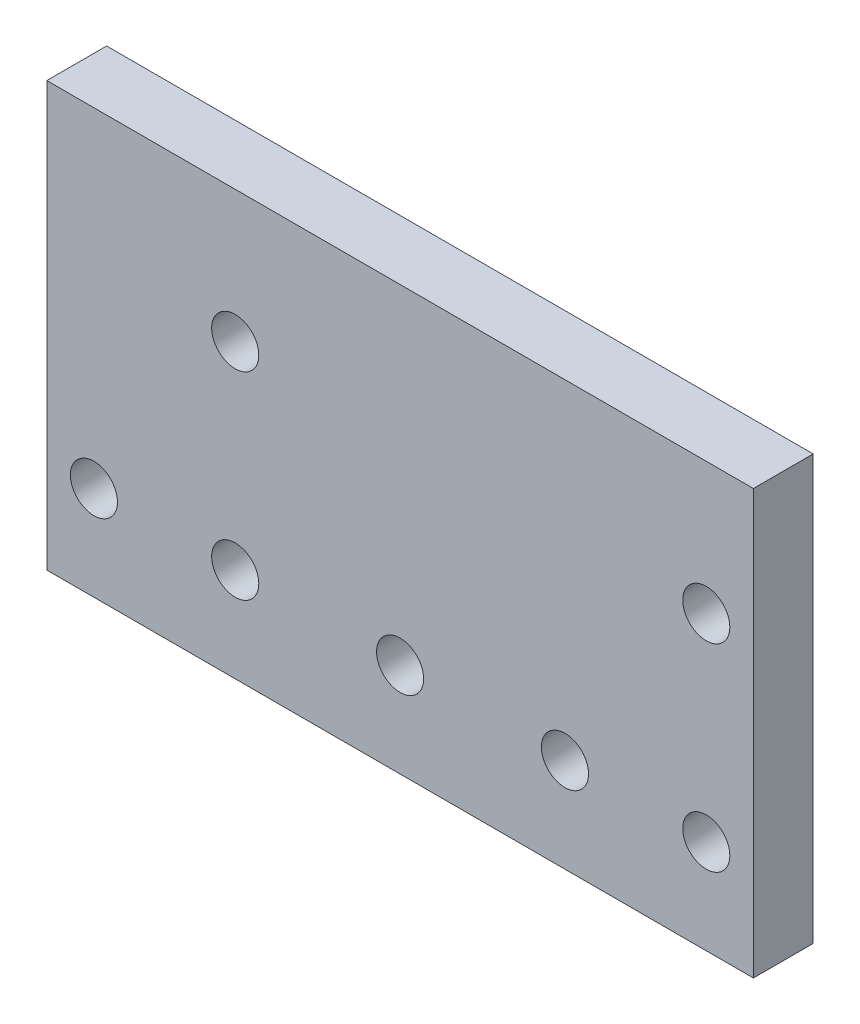
ISO-10303-21;
HEADER;
FILE_DESCRIPTION(('STEP AP214'),'2;1');
FILE_NAME('part.step','',(''),(''),'','','');
FILE_SCHEMA(('AUTOMOTIVE_DESIGN { 1 0 10303 214 1 1 1 1 }'));
ENDSEC;
DATA;
#1=APPLICATION_CONTEXT('core data for automotive mechanical design processes');
#2=APPLICATION_PROTOCOL_DEFINITION('international standard','automotive_design',2000,#1);
#3=PRODUCT_CONTEXT('',#1,'mechanical');
#4=PRODUCT('Part','Part','',(#3));
#5=PRODUCT_RELATED_PRODUCT_CATEGORY('part','',(#4));
#6=PRODUCT_DEFINITION_FORMATION('','',#4);
#7=PRODUCT_DEFINITION_CONTEXT('part definition',#1,'design');
#8=PRODUCT_DEFINITION('design','',#6,#7);
#9=PRODUCT_DEFINITION_SHAPE('','',#8);
#10=(LENGTH_UNIT() NAMED_UNIT(*) SI_UNIT(.MILLI.,.METRE.));
#11=(NAMED_UNIT(*) PLANE_ANGLE_UNIT() SI_UNIT($,.RADIAN.));
#12=(NAMED_UNIT(*) SI_UNIT($,.STERADIAN.) SOLID_ANGLE_UNIT());
#13=UNCERTAINTY_MEASURE_WITH_UNIT(LENGTH_MEASURE(1.E-05),#10,'distance_accuracy_value','');
#14=(GEOMETRIC_REPRESENTATION_CONTEXT(3) GLOBAL_UNCERTAINTY_ASSIGNED_CONTEXT((#13)) GLOBAL_UNIT_ASSIGNED_CONTEXT((#10,
#11,#12)) REPRESENTATION_CONTEXT('',''));
#15=CARTESIAN_POINT('',(0.,0.,0.));
#16=DIRECTION('',(0.,0.,1.));
#17=DIRECTION('',(1.,0.,0.));
#18=AXIS2_PLACEMENT_3D('',#15,#16,#17);
#19=CARTESIAN_POINT('',(0.,0.,6.35));
#20=DIRECTION('',(0.,0.,-1.));
#21=DIRECTION('',(-1.,0.,0.));
#22=AXIS2_PLACEMENT_3D('',#19,#20,#21);
#23=PLANE('',#22);
#24=CARTESIAN_POINT('',(70.,10.,6.35));
#25=DIRECTION('',(0.,0.,1.));
#26=DIRECTION('',(1.,0.,0.));
#27=AXIS2_PLACEMENT_3D('',#24,#25,#26);
#28=CIRCLE('',#27,2.50000000000001);
#29=CARTESIAN_POINT('',(72.5,10.,6.35));
#30=VERTEX_POINT('',#29);
#31=EDGE_CURVE('E139',#30,#30,#28,.T.);
#32=ORIENTED_EDGE('',*,*,#31,.F.);
#33=EDGE_LOOP('',(#32));
#34=FACE_BOUND('',#33,.T.);
#35=CARTESIAN_POINT('',(20.,10.,6.35));
#36=DIRECTION('',(0.,0.,1.));
#37=DIRECTION('',(1.,0.,0.));
#38=AXIS2_PLACEMENT_3D('',#35,#36,#37);
#39=CIRCLE('',#38,2.5);
#40=CARTESIAN_POINT('',(22.5,10.,6.35));
#41=VERTEX_POINT('',#40);
#42=EDGE_CURVE('E127',#41,#41,#39,.T.);
#43=ORIENTED_EDGE('',*,*,#42,.F.);
#44=EDGE_LOOP('',(#43));
#45=FACE_BOUND('',#44,.T.);
#46=CARTESIAN_POINT('',(70.,31.,6.35));
#47=DIRECTION('',(0.,0.,1.));
#48=DIRECTION('',(1.,0.,0.));
#49=AXIS2_PLACEMENT_3D('',#46,#47,#48);
#50=CIRCLE('',#49,2.5);
#51=CARTESIAN_POINT('',(72.5,31.,6.35));
#52=VERTEX_POINT('',#51);
#53=EDGE_CURVE('E115',#52,#52,#50,.T.);
#54=ORIENTED_EDGE('',*,*,#53,.F.);
#55=EDGE_LOOP('',(#54));
#56=FACE_BOUND('',#55,.T.);
#57=DIRECTION('',(0.,-1.,0.));
#58=VECTOR('',#57,1.);
#59=CARTESIAN_POINT('',(0.,0.,6.35));
#60=LINE('',#59,#58);
#61=CARTESIAN_POINT('',(0.,45.,6.35));
#62=VERTEX_POINT('',#61);
#63=CARTESIAN_POINT('',(0.,0.,6.35));
#64=VERTEX_POINT('',#63);
#65=EDGE_CURVE('E85',#62,#64,#60,.T.);
#66=ORIENTED_EDGE('',*,*,#65,.T.);
#67=DIRECTION('',(1.,0.,0.));
#68=VECTOR('',#67,1.);
#69=CARTESIAN_POINT('',(0.,0.,6.35));
#70=LINE('',#69,#68);
#71=CARTESIAN_POINT('',(75.,0.,6.35));
#72=VERTEX_POINT('',#71);
#73=EDGE_CURVE('E80',#64,#72,#70,.T.);
#74=ORIENTED_EDGE('',*,*,#73,.T.);
#75=DIRECTION('',(0.,1.,0.));
#76=VECTOR('',#75,1.);
#77=CARTESIAN_POINT('',(75.,0.,6.35));
#78=LINE('',#77,#76);
#79=CARTESIAN_POINT('',(75.,45.,6.35));
#80=VERTEX_POINT('',#79);
#81=EDGE_CURVE('E83',#72,#80,#78,.T.);
#82=ORIENTED_EDGE('',*,*,#81,.T.);
#83=DIRECTION('',(-1.,0.,0.));
#84=VECTOR('',#83,1.);
#85=CARTESIAN_POINT('',(0.,45.,6.35));
#86=LINE('',#85,#84);
#87=EDGE_CURVE('E50',#80,#62,#86,.T.);
#88=ORIENTED_EDGE('',*,*,#87,.T.);
#89=EDGE_LOOP('',(#66,#74,#82,#88));
#90=FACE_BOUND('',#89,.T.);
#91=CARTESIAN_POINT('',(20.,31.,6.35));
#92=DIRECTION('',(0.,0.,1.));
#93=DIRECTION('',(1.,0.,0.));
#94=AXIS2_PLACEMENT_3D('',#91,#92,#93);
#95=CIRCLE('',#94,2.5);
#96=CARTESIAN_POINT('',(22.5,31.,6.35));
#97=VERTEX_POINT('',#96);
#98=EDGE_CURVE('E100',#97,#97,#95,.T.);
#99=ORIENTED_EDGE('',*,*,#98,.F.);
#100=EDGE_LOOP('',(#99));
#101=FACE_BOUND('',#100,.T.);
#102=CARTESIAN_POINT('',(5.,10.,6.35));
#103=DIRECTION('',(0.,0.,1.));
#104=DIRECTION('',(1.,0.,0.));
#105=AXIS2_PLACEMENT_3D('',#102,#103,#104);
#106=CIRCLE('',#105,2.5);
#107=CARTESIAN_POINT('',(7.5,10.,6.35));
#108=VERTEX_POINT('',#107);
#109=EDGE_CURVE('E121',#108,#108,#106,.T.);
#110=ORIENTED_EDGE('',*,*,#109,.F.);
#111=EDGE_LOOP('',(#110));
#112=FACE_BOUND('',#111,.T.);
#113=CARTESIAN_POINT('',(55.,10.,6.35));
#114=DIRECTION('',(0.,0.,1.));
#115=DIRECTION('',(1.,0.,0.));
#116=AXIS2_PLACEMENT_3D('',#113,#114,#115);
#117=CIRCLE('',#116,2.5);
#118=CARTESIAN_POINT('',(57.5,10.,6.35));
#119=VERTEX_POINT('',#118);
#120=EDGE_CURVE('E133',#119,#119,#117,.T.);
#121=ORIENTED_EDGE('',*,*,#120,.F.);
#122=EDGE_LOOP('',(#121));
#123=FACE_BOUND('',#122,.T.);
#124=CARTESIAN_POINT('',(37.5,10.,6.35));
#125=DIRECTION('',(0.,0.,1.));
#126=DIRECTION('',(1.,0.,0.));
#127=AXIS2_PLACEMENT_3D('',#124,#125,#126);
#128=CIRCLE('',#127,2.5);
#129=CARTESIAN_POINT('',(40.,10.,6.35));
#130=VERTEX_POINT('',#129);
#131=EDGE_CURVE('E145',#130,#130,#128,.T.);
#132=ORIENTED_EDGE('',*,*,#131,.F.);
#133=EDGE_LOOP('',(#132));
#134=FACE_BOUND('',#133,.T.);
#135=ADVANCED_FACE('F33',(#34,#45,#56,#90,#101,#112,#123,#134),#23,.F.);
#136=CARTESIAN_POINT('',(0.,0.,0.));
#137=DIRECTION('',(0.,0.,-1.));
#138=DIRECTION('',(-1.,0.,0.));
#139=AXIS2_PLACEMENT_3D('',#136,#137,#138);
#140=PLANE('',#139);
#141=CARTESIAN_POINT('',(70.,10.,0.));
#142=DIRECTION('',(0.,0.,1.));
#143=DIRECTION('',(1.,0.,0.));
#144=AXIS2_PLACEMENT_3D('',#141,#142,#143);
#145=CIRCLE('',#144,2.50000000000001);
#146=CARTESIAN_POINT('',(72.5,10.,0.));
#147=VERTEX_POINT('',#146);
#148=EDGE_CURVE('E142',#147,#147,#145,.T.);
#149=ORIENTED_EDGE('',*,*,#148,.T.);
#150=EDGE_LOOP('',(#149));
#151=FACE_BOUND('',#150,.T.);
#152=CARTESIAN_POINT('',(20.,10.,0.));
#153=DIRECTION('',(0.,0.,1.));
#154=DIRECTION('',(1.,0.,0.));
#155=AXIS2_PLACEMENT_3D('',#152,#153,#154);
#156=CIRCLE('',#155,2.5);
#157=CARTESIAN_POINT('',(22.5,10.,0.));
#158=VERTEX_POINT('',#157);
#159=EDGE_CURVE('E130',#158,#158,#156,.T.);
#160=ORIENTED_EDGE('',*,*,#159,.T.);
#161=EDGE_LOOP('',(#160));
#162=FACE_BOUND('',#161,.T.);
#163=CARTESIAN_POINT('',(70.,31.,0.));
#164=DIRECTION('',(0.,0.,1.));
#165=DIRECTION('',(1.,0.,0.));
#166=AXIS2_PLACEMENT_3D('',#163,#164,#165);
#167=CIRCLE('',#166,2.5);
#168=CARTESIAN_POINT('',(72.5,31.,0.));
#169=VERTEX_POINT('',#168);
#170=EDGE_CURVE('E118',#169,#169,#167,.T.);
#171=ORIENTED_EDGE('',*,*,#170,.T.);
#172=EDGE_LOOP('',(#171));
#173=FACE_BOUND('',#172,.T.);
#174=DIRECTION('',(0.,-1.,0.));
#175=VECTOR('',#174,1.);
#176=CARTESIAN_POINT('',(0.,0.,0.));
#177=LINE('',#176,#175);
#178=CARTESIAN_POINT('',(0.,45.,0.));
#179=VERTEX_POINT('',#178);
#180=CARTESIAN_POINT('',(0.,0.,0.));
#181=VERTEX_POINT('',#180);
#182=EDGE_CURVE('E97',#179,#181,#177,.T.);
#183=ORIENTED_EDGE('',*,*,#182,.F.);
#184=DIRECTION('',(-1.,0.,0.));
#185=VECTOR('',#184,1.);
#186=CARTESIAN_POINT('',(0.,45.,0.));
#187=LINE('',#186,#185);
#188=CARTESIAN_POINT('',(75.,45.,0.));
#189=VERTEX_POINT('',#188);
#190=EDGE_CURVE('E73',#189,#179,#187,.T.);
#191=ORIENTED_EDGE('',*,*,#190,.F.);
#192=DIRECTION('',(0.,1.,0.));
#193=VECTOR('',#192,1.);
#194=CARTESIAN_POINT('',(75.,0.,0.));
#195=LINE('',#194,#193);
#196=CARTESIAN_POINT('',(75.,0.,0.));
#197=VERTEX_POINT('',#196);
#198=EDGE_CURVE('E67',#197,#189,#195,.T.);
#199=ORIENTED_EDGE('',*,*,#198,.F.);
#200=DIRECTION('',(1.,0.,0.));
#201=VECTOR('',#200,1.);
#202=CARTESIAN_POINT('',(0.,0.,0.));
#203=LINE('',#202,#201);
#204=EDGE_CURVE('E89',#181,#197,#203,.T.);
#205=ORIENTED_EDGE('',*,*,#204,.F.);
#206=EDGE_LOOP('',(#183,#191,#199,#205));
#207=FACE_BOUND('',#206,.T.);
#208=CARTESIAN_POINT('',(20.,31.,0.));
#209=DIRECTION('',(0.,0.,1.));
#210=DIRECTION('',(1.,0.,0.));
#211=AXIS2_PLACEMENT_3D('',#208,#209,#210);
#212=CIRCLE('',#211,2.5);
#213=CARTESIAN_POINT('',(22.5,31.,0.));
#214=VERTEX_POINT('',#213);
#215=EDGE_CURVE('E112',#214,#214,#212,.T.);
#216=ORIENTED_EDGE('',*,*,#215,.T.);
#217=EDGE_LOOP('',(#216));
#218=FACE_BOUND('',#217,.T.);
#219=CARTESIAN_POINT('',(5.,10.,0.));
#220=DIRECTION('',(0.,0.,1.));
#221=DIRECTION('',(1.,0.,0.));
#222=AXIS2_PLACEMENT_3D('',#219,#220,#221);
#223=CIRCLE('',#222,2.5);
#224=CARTESIAN_POINT('',(7.5,10.,0.));
#225=VERTEX_POINT('',#224);
#226=EDGE_CURVE('E124',#225,#225,#223,.T.);
#227=ORIENTED_EDGE('',*,*,#226,.T.);
#228=EDGE_LOOP('',(#227));
#229=FACE_BOUND('',#228,.T.);
#230=CARTESIAN_POINT('',(55.,10.,0.));
#231=DIRECTION('',(0.,0.,1.));
#232=DIRECTION('',(1.,0.,0.));
#233=AXIS2_PLACEMENT_3D('',#230,#231,#232);
#234=CIRCLE('',#233,2.5);
#235=CARTESIAN_POINT('',(57.5,10.,0.));
#236=VERTEX_POINT('',#235);
#237=EDGE_CURVE('E136',#236,#236,#234,.T.);
#238=ORIENTED_EDGE('',*,*,#237,.T.);
#239=EDGE_LOOP('',(#238));
#240=FACE_BOUND('',#239,.T.);
#241=CARTESIAN_POINT('',(37.5,10.,0.));
#242=DIRECTION('',(0.,0.,1.));
#243=DIRECTION('',(1.,0.,0.));
#244=AXIS2_PLACEMENT_3D('',#241,#242,#243);
#245=CIRCLE('',#244,2.5);
#246=CARTESIAN_POINT('',(40.,10.,0.));
#247=VERTEX_POINT('',#246);
#248=EDGE_CURVE('E148',#247,#247,#245,.T.);
#249=ORIENTED_EDGE('',*,*,#248,.T.);
#250=EDGE_LOOP('',(#249));
#251=FACE_BOUND('',#250,.T.);
#252=ADVANCED_FACE('F108',(#151,#162,#173,#207,#218,#229,#240,#251),#140,.T.);
#253=CARTESIAN_POINT('',(0.,0.,6.35));
#254=DIRECTION('',(1.,0.,0.));
#255=DIRECTION('',(0.,0.,-1.));
#256=AXIS2_PLACEMENT_3D('',#253,#254,#255);
#257=PLANE('',#256);
#258=ORIENTED_EDGE('',*,*,#182,.T.);
#259=DIRECTION('',(0.,0.,-1.));
#260=VECTOR('',#259,1.);
#261=CARTESIAN_POINT('',(0.,0.,6.35));
#262=LINE('',#261,#260);
#263=EDGE_CURVE('E11',#64,#181,#262,.T.);
#264=ORIENTED_EDGE('',*,*,#263,.F.);
#265=ORIENTED_EDGE('',*,*,#65,.F.);
#266=DIRECTION('',(0.,0.,-1.));
#267=VECTOR('',#266,1.);
#268=CARTESIAN_POINT('',(0.,45.,6.35));
#269=LINE('',#268,#267);
#270=EDGE_CURVE('E93',#62,#179,#269,.T.);
#271=ORIENTED_EDGE('',*,*,#270,.T.);
#272=EDGE_LOOP('',(#258,#264,#265,#271));
#273=FACE_BOUND('',#272,.T.);
#274=ADVANCED_FACE('F35',(#273),#257,.F.);
#275=CARTESIAN_POINT('',(0.,0.,6.35));
#276=DIRECTION('',(0.,1.,0.));
#277=DIRECTION('',(0.,0.,1.));
#278=AXIS2_PLACEMENT_3D('',#275,#276,#277);
#279=PLANE('',#278);
#280=ORIENTED_EDGE('',*,*,#204,.T.);
#281=DIRECTION('',(0.,0.,-1.));
#282=VECTOR('',#281,1.);
#283=CARTESIAN_POINT('',(75.,0.,6.35));
#284=LINE('',#283,#282);
#285=EDGE_CURVE('E42',#72,#197,#284,.T.);
#286=ORIENTED_EDGE('',*,*,#285,.F.);
#287=ORIENTED_EDGE('',*,*,#73,.F.);
#288=ORIENTED_EDGE('',*,*,#263,.T.);
#289=EDGE_LOOP('',(#280,#286,#287,#288));
#290=FACE_BOUND('',#289,.T.);
#291=ADVANCED_FACE('F88',(#290),#279,.F.);
#292=CARTESIAN_POINT('',(75.,0.,6.35));
#293=DIRECTION('',(-1.,0.,0.));
#294=DIRECTION('',(0.,0.,1.));
#295=AXIS2_PLACEMENT_3D('',#292,#293,#294);
#296=PLANE('',#295);
#297=ORIENTED_EDGE('',*,*,#198,.T.);
#298=DIRECTION('',(0.,0.,-1.));
#299=VECTOR('',#298,1.);
#300=CARTESIAN_POINT('',(75.,45.,6.35));
#301=LINE('',#300,#299);
#302=EDGE_CURVE('E90',#80,#189,#301,.T.);
#303=ORIENTED_EDGE('',*,*,#302,.F.);
#304=ORIENTED_EDGE('',*,*,#81,.F.);
#305=ORIENTED_EDGE('',*,*,#285,.T.);
#306=EDGE_LOOP('',(#297,#303,#304,#305));
#307=FACE_BOUND('',#306,.T.);
#308=ADVANCED_FACE('F91',(#307),#296,.F.);
#309=CARTESIAN_POINT('',(0.,45.,6.35));
#310=DIRECTION('',(0.,-1.,0.));
#311=DIRECTION('',(0.,0.,-1.));
#312=AXIS2_PLACEMENT_3D('',#309,#310,#311);
#313=PLANE('',#312);
#314=ORIENTED_EDGE('',*,*,#190,.T.);
#315=ORIENTED_EDGE('',*,*,#270,.F.);
#316=ORIENTED_EDGE('',*,*,#87,.F.);
#317=ORIENTED_EDGE('',*,*,#302,.T.);
#318=EDGE_LOOP('',(#314,#315,#316,#317));
#319=FACE_BOUND('',#318,.T.);
#320=ADVANCED_FACE('F105',(#319),#313,.F.);
#321=CARTESIAN_POINT('',(20.,31.,6.35));
#322=DIRECTION('',(0.,0.,-1.));
#323=DIRECTION('',(-1.,0.,0.));
#324=AXIS2_PLACEMENT_3D('',#321,#322,#323);
#325=CYLINDRICAL_SURFACE('',#324,2.5);
#326=ORIENTED_EDGE('',*,*,#98,.T.);
#327=EDGE_LOOP('',(#326));
#328=FACE_BOUND('',#327,.T.);
#329=ORIENTED_EDGE('',*,*,#215,.F.);
#330=EDGE_LOOP('',(#329));
#331=FACE_BOUND('',#330,.T.);
#332=ADVANCED_FACE('F168',(#328,#331),#325,.F.);
#333=CARTESIAN_POINT('',(70.,31.,6.35));
#334=DIRECTION('',(0.,0.,-1.));
#335=DIRECTION('',(-1.,0.,0.));
#336=AXIS2_PLACEMENT_3D('',#333,#334,#335);
#337=CYLINDRICAL_SURFACE('',#336,2.5);
#338=ORIENTED_EDGE('',*,*,#53,.T.);
#339=EDGE_LOOP('',(#338));
#340=FACE_BOUND('',#339,.T.);
#341=ORIENTED_EDGE('',*,*,#170,.F.);
#342=EDGE_LOOP('',(#341));
#343=FACE_BOUND('',#342,.T.);
#344=ADVANCED_FACE('F214',(#340,#343),#337,.F.);
#345=CARTESIAN_POINT('',(5.,10.,6.35));
#346=DIRECTION('',(0.,0.,-1.));
#347=DIRECTION('',(-1.,0.,0.));
#348=AXIS2_PLACEMENT_3D('',#345,#346,#347);
#349=CYLINDRICAL_SURFACE('',#348,2.5);
#350=ORIENTED_EDGE('',*,*,#109,.T.);
#351=EDGE_LOOP('',(#350));
#352=FACE_BOUND('',#351,.T.);
#353=ORIENTED_EDGE('',*,*,#226,.F.);
#354=EDGE_LOOP('',(#353));
#355=FACE_BOUND('',#354,.T.);
#356=ADVANCED_FACE('F222',(#352,#355),#349,.F.);
#357=CARTESIAN_POINT('',(20.,10.,6.35));
#358=DIRECTION('',(0.,0.,-1.));
#359=DIRECTION('',(-1.,0.,0.));
#360=AXIS2_PLACEMENT_3D('',#357,#358,#359);
#361=CYLINDRICAL_SURFACE('',#360,2.5);
#362=ORIENTED_EDGE('',*,*,#42,.T.);
#363=EDGE_LOOP('',(#362));
#364=FACE_BOUND('',#363,.T.);
#365=ORIENTED_EDGE('',*,*,#159,.F.);
#366=EDGE_LOOP('',(#365));
#367=FACE_BOUND('',#366,.T.);
#368=ADVANCED_FACE('F230',(#364,#367),#361,.F.);
#369=CARTESIAN_POINT('',(55.,10.,6.35));
#370=DIRECTION('',(0.,0.,-1.));
#371=DIRECTION('',(-1.,0.,0.));
#372=AXIS2_PLACEMENT_3D('',#369,#370,#371);
#373=CYLINDRICAL_SURFACE('',#372,2.5);
#374=ORIENTED_EDGE('',*,*,#120,.T.);
#375=EDGE_LOOP('',(#374));
#376=FACE_BOUND('',#375,.T.);
#377=ORIENTED_EDGE('',*,*,#237,.F.);
#378=EDGE_LOOP('',(#377));
#379=FACE_BOUND('',#378,.T.);
#380=ADVANCED_FACE('F239',(#376,#379),#373,.F.);
#381=CARTESIAN_POINT('',(70.,10.,6.35));
#382=DIRECTION('',(0.,0.,-1.));
#383=DIRECTION('',(-1.,0.,0.));
#384=AXIS2_PLACEMENT_3D('',#381,#382,#383);
#385=CYLINDRICAL_SURFACE('',#384,2.50000000000001);
#386=ORIENTED_EDGE('',*,*,#31,.T.);
#387=EDGE_LOOP('',(#386));
#388=FACE_BOUND('',#387,.T.);
#389=ORIENTED_EDGE('',*,*,#148,.F.);
#390=EDGE_LOOP('',(#389));
#391=FACE_BOUND('',#390,.T.);
#392=ADVANCED_FACE('F248',(#388,#391),#385,.F.);
#393=CARTESIAN_POINT('',(37.5,10.,6.35));
#394=DIRECTION('',(0.,0.,-1.));
#395=DIRECTION('',(-1.,0.,0.));
#396=AXIS2_PLACEMENT_3D('',#393,#394,#395);
#397=CYLINDRICAL_SURFACE('',#396,2.5);
#398=ORIENTED_EDGE('',*,*,#131,.T.);
#399=EDGE_LOOP('',(#398));
#400=FACE_BOUND('',#399,.T.);
#401=ORIENTED_EDGE('',*,*,#248,.F.);
#402=EDGE_LOOP('',(#401));
#403=FACE_BOUND('',#402,.T.);
#404=ADVANCED_FACE('F154',(#400,#403),#397,.F.);
#405=CLOSED_SHELL('',(#135,#252,#274,#291,#308,#320,#332,#344,#356,#368,#380,#392,#404));
#406=MANIFOLD_SOLID_BREP('B2',#405);
#407=ADVANCED_BREP_SHAPE_REPRESENTATION('',(#18,#406),#14);
#408=SHAPE_DEFINITION_REPRESENTATION(#9,#407);
ENDSEC;
END-ISO-10303-21;
